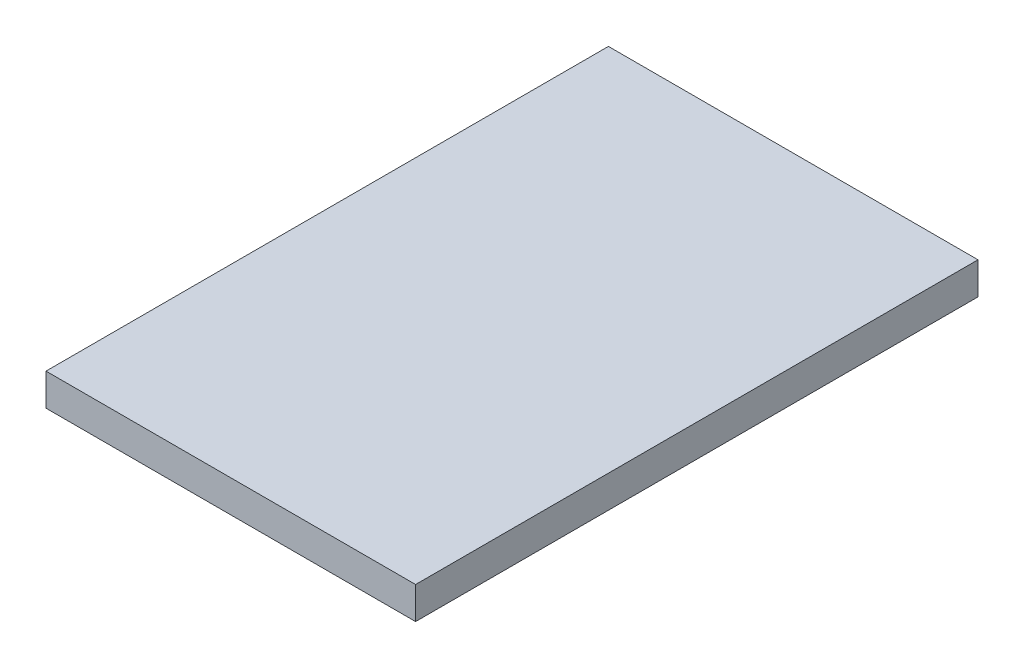
ISO-10303-21;
HEADER;
FILE_DESCRIPTION(('STEP AP214'),'2;1');
FILE_NAME('part.step','',(''),(''),'','','');
FILE_SCHEMA(('AUTOMOTIVE_DESIGN { 1 0 10303 214 1 1 1 1 }'));
ENDSEC;
DATA;
#1=APPLICATION_CONTEXT('core data for automotive mechanical design processes');
#2=APPLICATION_PROTOCOL_DEFINITION('international standard','automotive_design',2000,#1);
#3=PRODUCT_CONTEXT('',#1,'mechanical');
#4=PRODUCT('Part','Part','',(#3));
#5=PRODUCT_RELATED_PRODUCT_CATEGORY('part','',(#4));
#6=PRODUCT_DEFINITION_FORMATION('','',#4);
#7=PRODUCT_DEFINITION_CONTEXT('part definition',#1,'design');
#8=PRODUCT_DEFINITION('design','',#6,#7);
#9=PRODUCT_DEFINITION_SHAPE('','',#8);
#10=(LENGTH_UNIT() NAMED_UNIT(*) SI_UNIT(.MILLI.,.METRE.));
#11=(NAMED_UNIT(*) PLANE_ANGLE_UNIT() SI_UNIT($,.RADIAN.));
#12=(NAMED_UNIT(*) SI_UNIT($,.STERADIAN.) SOLID_ANGLE_UNIT());
#13=UNCERTAINTY_MEASURE_WITH_UNIT(LENGTH_MEASURE(1.E-05),#10,'distance_accuracy_value','');
#14=(GEOMETRIC_REPRESENTATION_CONTEXT(3) GLOBAL_UNCERTAINTY_ASSIGNED_CONTEXT((#13)) GLOBAL_UNIT_ASSIGNED_CONTEXT((#10,
#11,#12)) REPRESENTATION_CONTEXT('',''));
#15=CARTESIAN_POINT('',(0.,0.,0.));
#16=DIRECTION('',(0.,0.,1.));
#17=DIRECTION('',(1.,0.,0.));
#18=AXIS2_PLACEMENT_3D('',#15,#16,#17);
#19=CARTESIAN_POINT('',(0.,-270.,-111.));
#20=DIRECTION('',(1.,0.,0.));
#21=DIRECTION('',(0.,0.,-1.));
#22=AXIS2_PLACEMENT_3D('',#19,#20,#21);
#23=PLANE('',#22);
#24=DIRECTION('',(0.,0.,-1.));
#25=VECTOR('',#24,1.);
#26=CARTESIAN_POINT('',(0.,-250.,-111.));
#27=LINE('',#26,#25);
#28=CARTESIAN_POINT('',(0.,-250.,239.));
#29=VERTEX_POINT('',#28);
#30=CARTESIAN_POINT('',(0.,-250.,-111.));
#31=VERTEX_POINT('',#30);
#32=EDGE_CURVE('E113',#29,#31,#27,.T.);
#33=ORIENTED_EDGE('',*,*,#32,.T.);
#34=DIRECTION('',(0.,1.,0.));
#35=VECTOR('',#34,1.);
#36=CARTESIAN_POINT('',(0.,-270.,-111.));
#37=LINE('',#36,#35);
#38=CARTESIAN_POINT('',(0.,-270.,-111.));
#39=VERTEX_POINT('',#38);
#40=EDGE_CURVE('E11',#39,#31,#37,.T.);
#41=ORIENTED_EDGE('',*,*,#40,.F.);
#42=DIRECTION('',(0.,0.,-1.));
#43=VECTOR('',#42,1.);
#44=CARTESIAN_POINT('',(0.,-270.,-111.));
#45=LINE('',#44,#43);
#46=CARTESIAN_POINT('',(0.,-270.,239.));
#47=VERTEX_POINT('',#46);
#48=EDGE_CURVE('E97',#47,#39,#45,.T.);
#49=ORIENTED_EDGE('',*,*,#48,.F.);
#50=DIRECTION('',(0.,1.,0.));
#51=VECTOR('',#50,1.);
#52=CARTESIAN_POINT('',(0.,-270.,239.));
#53=LINE('',#52,#51);
#54=EDGE_CURVE('E109',#47,#29,#53,.T.);
#55=ORIENTED_EDGE('',*,*,#54,.T.);
#56=EDGE_LOOP('',(#33,#41,#49,#55));
#57=FACE_BOUND('',#56,.T.);
#58=ADVANCED_FACE('F45',(#57),#23,.F.);
#59=CARTESIAN_POINT('',(230.,-270.,-111.));
#60=DIRECTION('',(0.,0.,1.));
#61=DIRECTION('',(1.,0.,0.));
#62=AXIS2_PLACEMENT_3D('',#59,#60,#61);
#63=PLANE('',#62);
#64=DIRECTION('',(1.,0.,0.));
#65=VECTOR('',#64,1.);
#66=CARTESIAN_POINT('',(230.,-250.,-111.));
#67=LINE('',#66,#65);
#68=CARTESIAN_POINT('',(230.,-250.,-111.));
#69=VERTEX_POINT('',#68);
#70=EDGE_CURVE('E102',#31,#69,#67,.T.);
#71=ORIENTED_EDGE('',*,*,#70,.T.);
#72=DIRECTION('',(0.,1.,0.));
#73=VECTOR('',#72,1.);
#74=CARTESIAN_POINT('',(230.,-270.,-111.));
#75=LINE('',#74,#73);
#76=CARTESIAN_POINT('',(230.,-270.,-111.));
#77=VERTEX_POINT('',#76);
#78=EDGE_CURVE('E54',#77,#69,#75,.T.);
#79=ORIENTED_EDGE('',*,*,#78,.F.);
#80=DIRECTION('',(1.,0.,0.));
#81=VECTOR('',#80,1.);
#82=CARTESIAN_POINT('',(230.,-270.,-111.));
#83=LINE('',#82,#81);
#84=EDGE_CURVE('E92',#39,#77,#83,.T.);
#85=ORIENTED_EDGE('',*,*,#84,.F.);
#86=ORIENTED_EDGE('',*,*,#40,.T.);
#87=EDGE_LOOP('',(#71,#79,#85,#86));
#88=FACE_BOUND('',#87,.T.);
#89=ADVANCED_FACE('F101',(#88),#63,.F.);
#90=CARTESIAN_POINT('',(230.,-270.,239.));
#91=DIRECTION('',(-1.,0.,0.));
#92=DIRECTION('',(0.,0.,1.));
#93=AXIS2_PLACEMENT_3D('',#90,#91,#92);
#94=PLANE('',#93);
#95=DIRECTION('',(0.,0.,1.));
#96=VECTOR('',#95,1.);
#97=CARTESIAN_POINT('',(230.,-250.,239.));
#98=LINE('',#97,#96);
#99=CARTESIAN_POINT('',(230.,-250.,239.));
#100=VERTEX_POINT('',#99);
#101=EDGE_CURVE('E79',#69,#100,#98,.T.);
#102=ORIENTED_EDGE('',*,*,#101,.T.);
#103=DIRECTION('',(0.,1.,0.));
#104=VECTOR('',#103,1.);
#105=CARTESIAN_POINT('',(230.,-270.,239.));
#106=LINE('',#105,#104);
#107=CARTESIAN_POINT('',(230.,-270.,239.));
#108=VERTEX_POINT('',#107);
#109=EDGE_CURVE('E104',#108,#100,#106,.T.);
#110=ORIENTED_EDGE('',*,*,#109,.F.);
#111=DIRECTION('',(0.,0.,1.));
#112=VECTOR('',#111,1.);
#113=CARTESIAN_POINT('',(230.,-270.,239.));
#114=LINE('',#113,#112);
#115=EDGE_CURVE('E95',#77,#108,#114,.T.);
#116=ORIENTED_EDGE('',*,*,#115,.F.);
#117=ORIENTED_EDGE('',*,*,#78,.T.);
#118=EDGE_LOOP('',(#102,#110,#116,#117));
#119=FACE_BOUND('',#118,.T.);
#120=ADVANCED_FACE('F105',(#119),#94,.F.);
#121=CARTESIAN_POINT('',(0.,-270.,239.));
#122=DIRECTION('',(0.,0.,-1.));
#123=DIRECTION('',(-1.,0.,0.));
#124=AXIS2_PLACEMENT_3D('',#121,#122,#123);
#125=PLANE('',#124);
#126=DIRECTION('',(-1.,0.,0.));
#127=VECTOR('',#126,1.);
#128=CARTESIAN_POINT('',(0.,-250.,239.));
#129=LINE('',#128,#127);
#130=EDGE_CURVE('E85',#100,#29,#129,.T.);
#131=ORIENTED_EDGE('',*,*,#130,.T.);
#132=ORIENTED_EDGE('',*,*,#54,.F.);
#133=DIRECTION('',(-1.,0.,0.));
#134=VECTOR('',#133,1.);
#135=CARTESIAN_POINT('',(0.,-270.,239.));
#136=LINE('',#135,#134);
#137=EDGE_CURVE('E62',#108,#47,#136,.T.);
#138=ORIENTED_EDGE('',*,*,#137,.F.);
#139=ORIENTED_EDGE('',*,*,#109,.T.);
#140=EDGE_LOOP('',(#131,#132,#138,#139));
#141=FACE_BOUND('',#140,.T.);
#142=ADVANCED_FACE('F126',(#141),#125,.F.);
#143=CARTESIAN_POINT('',(0.,-270.,0.));
#144=DIRECTION('',(0.,1.,0.));
#145=DIRECTION('',(0.,0.,1.));
#146=AXIS2_PLACEMENT_3D('',#143,#144,#145);
#147=PLANE('',#146);
#148=ORIENTED_EDGE('',*,*,#48,.T.);
#149=ORIENTED_EDGE('',*,*,#84,.T.);
#150=ORIENTED_EDGE('',*,*,#115,.T.);
#151=ORIENTED_EDGE('',*,*,#137,.T.);
#152=EDGE_LOOP('',(#148,#149,#150,#151));
#153=FACE_BOUND('',#152,.T.);
#154=ADVANCED_FACE('F93',(#153),#147,.F.);
#155=CARTESIAN_POINT('',(0.,-250.,0.));
#156=DIRECTION('',(0.,1.,0.));
#157=DIRECTION('',(0.,0.,1.));
#158=AXIS2_PLACEMENT_3D('',#155,#156,#157);
#159=PLANE('',#158);
#160=ORIENTED_EDGE('',*,*,#32,.F.);
#161=ORIENTED_EDGE('',*,*,#130,.F.);
#162=ORIENTED_EDGE('',*,*,#101,.F.);
#163=ORIENTED_EDGE('',*,*,#70,.F.);
#164=EDGE_LOOP('',(#160,#161,#162,#163));
#165=FACE_BOUND('',#164,.T.);
#166=ADVANCED_FACE('F129',(#165),#159,.T.);
#167=CLOSED_SHELL('',(#58,#89,#120,#142,#154,#166));
#168=MANIFOLD_SOLID_BREP('B2',#167);
#169=ADVANCED_BREP_SHAPE_REPRESENTATION('',(#18,#168),#14);
#170=SHAPE_DEFINITION_REPRESENTATION(#9,#169);
ENDSEC;
END-ISO-10303-21;
